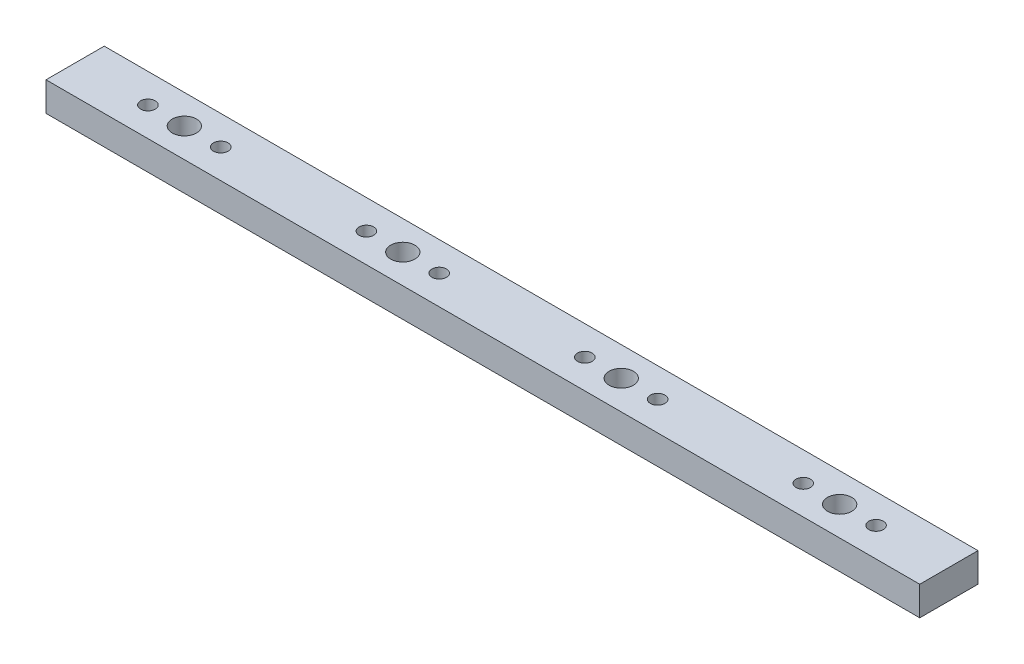
ISO-10303-21;
HEADER;
FILE_DESCRIPTION(('STEP AP214'),'2;1');
FILE_NAME('part.step','',(''),(''),'','','');
FILE_SCHEMA(('AUTOMOTIVE_DESIGN { 1 0 10303 214 1 1 1 1 }'));
ENDSEC;
DATA;
#1=APPLICATION_CONTEXT('core data for automotive mechanical design processes');
#2=APPLICATION_PROTOCOL_DEFINITION('international standard','automotive_design',2000,#1);
#3=PRODUCT_CONTEXT('',#1,'mechanical');
#4=PRODUCT('Part','Part','',(#3));
#5=PRODUCT_RELATED_PRODUCT_CATEGORY('part','',(#4));
#6=PRODUCT_DEFINITION_FORMATION('','',#4);
#7=PRODUCT_DEFINITION_CONTEXT('part definition',#1,'design');
#8=PRODUCT_DEFINITION('design','',#6,#7);
#9=PRODUCT_DEFINITION_SHAPE('','',#8);
#10=(LENGTH_UNIT() NAMED_UNIT(*) SI_UNIT(.MILLI.,.METRE.));
#11=(NAMED_UNIT(*) PLANE_ANGLE_UNIT() SI_UNIT($,.RADIAN.));
#12=(NAMED_UNIT(*) SI_UNIT($,.STERADIAN.) SOLID_ANGLE_UNIT());
#13=UNCERTAINTY_MEASURE_WITH_UNIT(LENGTH_MEASURE(1.E-05),#10,'distance_accuracy_value','');
#14=(GEOMETRIC_REPRESENTATION_CONTEXT(3) GLOBAL_UNCERTAINTY_ASSIGNED_CONTEXT((#13)) GLOBAL_UNIT_ASSIGNED_CONTEXT((#10,
#11,#12)) REPRESENTATION_CONTEXT('',''));
#15=CARTESIAN_POINT('',(0.,0.,0.));
#16=DIRECTION('',(0.,0.,1.));
#17=DIRECTION('',(1.,0.,0.));
#18=AXIS2_PLACEMENT_3D('',#15,#16,#17);
#19=CARTESIAN_POINT('',(180.,12.,12.));
#20=DIRECTION('',(-1.,0.,0.));
#21=DIRECTION('',(0.,0.,1.));
#22=AXIS2_PLACEMENT_3D('',#19,#20,#21);
#23=PLANE('',#22);
#24=DIRECTION('',(0.,0.,-1.));
#25=VECTOR('',#24,1.);
#26=CARTESIAN_POINT('',(180.,0.,12.));
#27=LINE('',#26,#25);
#28=CARTESIAN_POINT('',(180.,0.,12.));
#29=VERTEX_POINT('',#28);
#30=CARTESIAN_POINT('',(180.,0.,-12.));
#31=VERTEX_POINT('',#30);
#32=EDGE_CURVE('E104',#29,#31,#27,.T.);
#33=ORIENTED_EDGE('',*,*,#32,.T.);
#34=DIRECTION('',(0.,-1.,0.));
#35=VECTOR('',#34,1.);
#36=CARTESIAN_POINT('',(180.,12.,-12.));
#37=LINE('',#36,#35);
#38=CARTESIAN_POINT('',(180.,12.,-12.));
#39=VERTEX_POINT('',#38);
#40=EDGE_CURVE('E95',#39,#31,#37,.T.);
#41=ORIENTED_EDGE('',*,*,#40,.F.);
#42=DIRECTION('',(0.,0.,-1.));
#43=VECTOR('',#42,1.);
#44=CARTESIAN_POINT('',(180.,12.,12.));
#45=LINE('',#44,#43);
#46=CARTESIAN_POINT('',(180.,12.,12.));
#47=VERTEX_POINT('',#46);
#48=EDGE_CURVE('E89',#47,#39,#45,.T.);
#49=ORIENTED_EDGE('',*,*,#48,.F.);
#50=DIRECTION('',(0.,-1.,0.));
#51=VECTOR('',#50,1.);
#52=CARTESIAN_POINT('',(180.,12.,12.));
#53=LINE('',#52,#51);
#54=EDGE_CURVE('E100',#47,#29,#53,.T.);
#55=ORIENTED_EDGE('',*,*,#54,.T.);
#56=EDGE_LOOP('',(#33,#41,#49,#55));
#57=FACE_BOUND('',#56,.T.);
#58=ADVANCED_FACE('F35',(#57),#23,.F.);
#59=CARTESIAN_POINT('',(-180.,12.,-12.));
#60=DIRECTION('',(0.,0.,1.));
#61=DIRECTION('',(1.,0.,0.));
#62=AXIS2_PLACEMENT_3D('',#59,#60,#61);
#63=PLANE('',#62);
#64=DIRECTION('',(-1.,0.,0.));
#65=VECTOR('',#64,1.);
#66=CARTESIAN_POINT('',(-180.,0.,-12.));
#67=LINE('',#66,#65);
#68=CARTESIAN_POINT('',(-180.,0.,-12.));
#69=VERTEX_POINT('',#68);
#70=EDGE_CURVE('E94',#31,#69,#67,.T.);
#71=ORIENTED_EDGE('',*,*,#70,.T.);
#72=DIRECTION('',(0.,-1.,0.));
#73=VECTOR('',#72,1.);
#74=CARTESIAN_POINT('',(-180.,12.,-12.));
#75=LINE('',#74,#73);
#76=CARTESIAN_POINT('',(-180.,12.,-12.));
#77=VERTEX_POINT('',#76);
#78=EDGE_CURVE('E92',#77,#69,#75,.T.);
#79=ORIENTED_EDGE('',*,*,#78,.F.);
#80=DIRECTION('',(-1.,0.,0.));
#81=VECTOR('',#80,1.);
#82=CARTESIAN_POINT('',(-180.,12.,-12.));
#83=LINE('',#82,#81);
#84=EDGE_CURVE('E83',#39,#77,#83,.T.);
#85=ORIENTED_EDGE('',*,*,#84,.F.);
#86=ORIENTED_EDGE('',*,*,#40,.T.);
#87=EDGE_LOOP('',(#71,#79,#85,#86));
#88=FACE_BOUND('',#87,.T.);
#89=ADVANCED_FACE('F93',(#88),#63,.F.);
#90=CARTESIAN_POINT('',(-180.,12.,12.));
#91=DIRECTION('',(1.,0.,0.));
#92=DIRECTION('',(0.,0.,-1.));
#93=AXIS2_PLACEMENT_3D('',#90,#91,#92);
#94=PLANE('',#93);
#95=DIRECTION('',(0.,0.,1.));
#96=VECTOR('',#95,1.);
#97=CARTESIAN_POINT('',(-180.,0.,12.));
#98=LINE('',#97,#96);
#99=CARTESIAN_POINT('',(-180.,0.,12.));
#100=VERTEX_POINT('',#99);
#101=EDGE_CURVE('E69',#69,#100,#98,.T.);
#102=ORIENTED_EDGE('',*,*,#101,.T.);
#103=DIRECTION('',(0.,-1.,0.));
#104=VECTOR('',#103,1.);
#105=CARTESIAN_POINT('',(-180.,12.,12.));
#106=LINE('',#105,#104);
#107=CARTESIAN_POINT('',(-180.,12.,12.));
#108=VERTEX_POINT('',#107);
#109=EDGE_CURVE('E96',#108,#100,#106,.T.);
#110=ORIENTED_EDGE('',*,*,#109,.F.);
#111=DIRECTION('',(0.,0.,1.));
#112=VECTOR('',#111,1.);
#113=CARTESIAN_POINT('',(-180.,12.,12.));
#114=LINE('',#113,#112);
#115=EDGE_CURVE('E87',#77,#108,#114,.T.);
#116=ORIENTED_EDGE('',*,*,#115,.F.);
#117=ORIENTED_EDGE('',*,*,#78,.T.);
#118=EDGE_LOOP('',(#102,#110,#116,#117));
#119=FACE_BOUND('',#118,.T.);
#120=ADVANCED_FACE('F98',(#119),#94,.F.);
#121=CARTESIAN_POINT('',(-180.,12.,12.));
#122=DIRECTION('',(0.,0.,-1.));
#123=DIRECTION('',(-1.,0.,0.));
#124=AXIS2_PLACEMENT_3D('',#121,#122,#123);
#125=PLANE('',#124);
#126=DIRECTION('',(1.,0.,0.));
#127=VECTOR('',#126,1.);
#128=CARTESIAN_POINT('',(-180.,0.,12.));
#129=LINE('',#128,#127);
#130=EDGE_CURVE('E75',#100,#29,#129,.T.);
#131=ORIENTED_EDGE('',*,*,#130,.T.);
#132=ORIENTED_EDGE('',*,*,#54,.F.);
#133=DIRECTION('',(1.,0.,0.));
#134=VECTOR('',#133,1.);
#135=CARTESIAN_POINT('',(-180.,12.,12.));
#136=LINE('',#135,#134);
#137=EDGE_CURVE('E52',#108,#47,#136,.T.);
#138=ORIENTED_EDGE('',*,*,#137,.F.);
#139=ORIENTED_EDGE('',*,*,#109,.T.);
#140=EDGE_LOOP('',(#131,#132,#138,#139));
#141=FACE_BOUND('',#140,.T.);
#142=ADVANCED_FACE('F154',(#141),#125,.F.);
#143=CARTESIAN_POINT('',(180.,12.,-12.));
#144=DIRECTION('',(0.,-1.,0.));
#145=DIRECTION('',(0.,0.,-1.));
#146=AXIS2_PLACEMENT_3D('',#143,#144,#145);
#147=PLANE('',#146);
#148=CARTESIAN_POINT('',(-30.,12.,0.));
#149=DIRECTION('',(0.,1.,0.));
#150=DIRECTION('',(0.,0.,1.));
#151=AXIS2_PLACEMENT_3D('',#148,#149,#150);
#152=CIRCLE('',#151,3.00000000000001);
#153=CARTESIAN_POINT('',(-30.,12.,3.00000000000001));
#154=VERTEX_POINT('',#153);
#155=EDGE_CURVE('E263',#154,#154,#152,.T.);
#156=ORIENTED_EDGE('',*,*,#155,.F.);
#157=EDGE_LOOP('',(#156));
#158=FACE_BOUND('',#157,.T.);
#159=CARTESIAN_POINT('',(-60.,12.,0.));
#160=DIRECTION('',(0.,1.,0.));
#161=DIRECTION('',(0.,0.,1.));
#162=AXIS2_PLACEMENT_3D('',#159,#160,#161);
#163=CIRCLE('',#162,2.99999999999999);
#164=CARTESIAN_POINT('',(-60.,12.,2.99999999999999));
#165=VERTEX_POINT('',#164);
#166=EDGE_CURVE('E257',#165,#165,#163,.T.);
#167=ORIENTED_EDGE('',*,*,#166,.F.);
#168=EDGE_LOOP('',(#167));
#169=FACE_BOUND('',#168,.T.);
#170=CARTESIAN_POINT('',(-45.,12.,0.));
#171=DIRECTION('',(0.,1.,0.));
#172=DIRECTION('',(0.,0.,1.));
#173=AXIS2_PLACEMENT_3D('',#170,#171,#172);
#174=CIRCLE('',#173,4.99999999999999);
#175=CARTESIAN_POINT('',(-45.,12.,4.99999999999999));
#176=VERTEX_POINT('',#175);
#177=EDGE_CURVE('E249',#176,#176,#174,.T.);
#178=ORIENTED_EDGE('',*,*,#177,.F.);
#179=EDGE_LOOP('',(#178));
#180=FACE_BOUND('',#179,.T.);
#181=CARTESIAN_POINT('',(-135.,12.,0.));
#182=DIRECTION('',(0.,1.,0.));
#183=DIRECTION('',(0.,0.,1.));
#184=AXIS2_PLACEMENT_3D('',#181,#182,#183);
#185=CIRCLE('',#184,4.99999999999999);
#186=CARTESIAN_POINT('',(-135.,12.,4.99999999999999));
#187=VERTEX_POINT('',#186);
#188=EDGE_CURVE('E243',#187,#187,#185,.T.);
#189=ORIENTED_EDGE('',*,*,#188,.F.);
#190=EDGE_LOOP('',(#189));
#191=FACE_BOUND('',#190,.T.);
#192=CARTESIAN_POINT('',(-120.,12.,0.));
#193=DIRECTION('',(0.,1.,0.));
#194=DIRECTION('',(0.,0.,1.));
#195=AXIS2_PLACEMENT_3D('',#192,#193,#194);
#196=CIRCLE('',#195,3.00000000000001);
#197=CARTESIAN_POINT('',(-120.,12.,3.00000000000001));
#198=VERTEX_POINT('',#197);
#199=EDGE_CURVE('E237',#198,#198,#196,.T.);
#200=ORIENTED_EDGE('',*,*,#199,.F.);
#201=EDGE_LOOP('',(#200));
#202=FACE_BOUND('',#201,.T.);
#203=CARTESIAN_POINT('',(-150.,12.,0.));
#204=DIRECTION('',(0.,1.,0.));
#205=DIRECTION('',(0.,0.,1.));
#206=AXIS2_PLACEMENT_3D('',#203,#204,#205);
#207=CIRCLE('',#206,2.99999999999999);
#208=CARTESIAN_POINT('',(-150.,12.,2.99999999999999));
#209=VERTEX_POINT('',#208);
#210=EDGE_CURVE('E107',#209,#209,#207,.T.);
#211=ORIENTED_EDGE('',*,*,#210,.F.);
#212=EDGE_LOOP('',(#211));
#213=FACE_BOUND('',#212,.T.);
#214=ORIENTED_EDGE('',*,*,#48,.T.);
#215=ORIENTED_EDGE('',*,*,#84,.T.);
#216=ORIENTED_EDGE('',*,*,#115,.T.);
#217=ORIENTED_EDGE('',*,*,#137,.T.);
#218=EDGE_LOOP('',(#214,#215,#216,#217));
#219=FACE_BOUND('',#218,.T.);
#220=CARTESIAN_POINT('',(45.,12.,0.));
#221=DIRECTION('',(0.,1.,0.));
#222=DIRECTION('',(0.,0.,1.));
#223=AXIS2_PLACEMENT_3D('',#220,#221,#222);
#224=CIRCLE('',#223,4.99999999999999);
#225=CARTESIAN_POINT('',(45.,12.,4.99999999999999));
#226=VERTEX_POINT('',#225);
#227=EDGE_CURVE('E117',#226,#226,#224,.T.);
#228=ORIENTED_EDGE('',*,*,#227,.F.);
#229=EDGE_LOOP('',(#228));
#230=FACE_BOUND('',#229,.T.);
#231=CARTESIAN_POINT('',(135.,12.,0.));
#232=DIRECTION('',(0.,1.,0.));
#233=DIRECTION('',(0.,0.,1.));
#234=AXIS2_PLACEMENT_3D('',#231,#232,#233);
#235=CIRCLE('',#234,4.99999999999999);
#236=CARTESIAN_POINT('',(135.,12.,4.99999999999999));
#237=VERTEX_POINT('',#236);
#238=EDGE_CURVE('E123',#237,#237,#235,.T.);
#239=ORIENTED_EDGE('',*,*,#238,.F.);
#240=EDGE_LOOP('',(#239));
#241=FACE_BOUND('',#240,.T.);
#242=CARTESIAN_POINT('',(30.,12.,0.));
#243=DIRECTION('',(0.,1.,0.));
#244=DIRECTION('',(0.,0.,1.));
#245=AXIS2_PLACEMENT_3D('',#242,#243,#244);
#246=CIRCLE('',#245,2.99999999999999);
#247=CARTESIAN_POINT('',(30.,12.,2.99999999999999));
#248=VERTEX_POINT('',#247);
#249=EDGE_CURVE('E129',#248,#248,#246,.T.);
#250=ORIENTED_EDGE('',*,*,#249,.F.);
#251=EDGE_LOOP('',(#250));
#252=FACE_BOUND('',#251,.T.);
#253=CARTESIAN_POINT('',(120.,12.,0.));
#254=DIRECTION('',(0.,1.,0.));
#255=DIRECTION('',(0.,0.,1.));
#256=AXIS2_PLACEMENT_3D('',#253,#254,#255);
#257=CIRCLE('',#256,2.99999999999999);
#258=CARTESIAN_POINT('',(120.,12.,2.99999999999999));
#259=VERTEX_POINT('',#258);
#260=EDGE_CURVE('E135',#259,#259,#257,.T.);
#261=ORIENTED_EDGE('',*,*,#260,.F.);
#262=EDGE_LOOP('',(#261));
#263=FACE_BOUND('',#262,.T.);
#264=CARTESIAN_POINT('',(60.,12.,0.));
#265=DIRECTION('',(0.,1.,0.));
#266=DIRECTION('',(0.,0.,1.));
#267=AXIS2_PLACEMENT_3D('',#264,#265,#266);
#268=CIRCLE('',#267,3.00000000000001);
#269=CARTESIAN_POINT('',(60.,12.,3.00000000000001));
#270=VERTEX_POINT('',#269);
#271=EDGE_CURVE('E141',#270,#270,#268,.T.);
#272=ORIENTED_EDGE('',*,*,#271,.F.);
#273=EDGE_LOOP('',(#272));
#274=FACE_BOUND('',#273,.T.);
#275=CARTESIAN_POINT('',(150.,12.,0.));
#276=DIRECTION('',(0.,1.,0.));
#277=DIRECTION('',(0.,0.,1.));
#278=AXIS2_PLACEMENT_3D('',#275,#276,#277);
#279=CIRCLE('',#278,3.00000000000001);
#280=CARTESIAN_POINT('',(150.,12.,3.00000000000001));
#281=VERTEX_POINT('',#280);
#282=EDGE_CURVE('E11',#281,#281,#279,.T.);
#283=ORIENTED_EDGE('',*,*,#282,.F.);
#284=EDGE_LOOP('',(#283));
#285=FACE_BOUND('',#284,.T.);
#286=ADVANCED_FACE('F84',(#158,#169,#180,#191,#202,#213,#219,#230,#241,#252,#263,#274,#285),
#147,.F.);
#287=CARTESIAN_POINT('',(180.,0.,-12.));
#288=DIRECTION('',(0.,-1.,0.));
#289=DIRECTION('',(0.,0.,-1.));
#290=AXIS2_PLACEMENT_3D('',#287,#288,#289);
#291=PLANE('',#290);
#292=CARTESIAN_POINT('',(-30.,0.,0.));
#293=DIRECTION('',(0.,-1.,0.));
#294=DIRECTION('',(0.,0.,-1.));
#295=AXIS2_PLACEMENT_3D('',#292,#293,#294);
#296=CIRCLE('',#295,3.00000000000001);
#297=CARTESIAN_POINT('',(-30.,0.,-3.00000000000001));
#298=VERTEX_POINT('',#297);
#299=EDGE_CURVE('E266',#298,#298,#296,.F.);
#300=ORIENTED_EDGE('',*,*,#299,.T.);
#301=EDGE_LOOP('',(#300));
#302=FACE_BOUND('',#301,.T.);
#303=CARTESIAN_POINT('',(-60.,0.,0.));
#304=DIRECTION('',(0.,-1.,0.));
#305=DIRECTION('',(0.,0.,-1.));
#306=AXIS2_PLACEMENT_3D('',#303,#304,#305);
#307=CIRCLE('',#306,2.99999999999999);
#308=CARTESIAN_POINT('',(-60.,0.,-2.99999999999999));
#309=VERTEX_POINT('',#308);
#310=EDGE_CURVE('E260',#309,#309,#307,.F.);
#311=ORIENTED_EDGE('',*,*,#310,.T.);
#312=EDGE_LOOP('',(#311));
#313=FACE_BOUND('',#312,.T.);
#314=CARTESIAN_POINT('',(-45.,0.,0.));
#315=DIRECTION('',(0.,-1.,0.));
#316=DIRECTION('',(0.,0.,-1.));
#317=AXIS2_PLACEMENT_3D('',#314,#315,#316);
#318=CIRCLE('',#317,4.99999999999999);
#319=CARTESIAN_POINT('',(-45.,0.,-4.99999999999999));
#320=VERTEX_POINT('',#319);
#321=EDGE_CURVE('E254',#320,#320,#318,.F.);
#322=ORIENTED_EDGE('',*,*,#321,.T.);
#323=EDGE_LOOP('',(#322));
#324=FACE_BOUND('',#323,.T.);
#325=CARTESIAN_POINT('',(-135.,0.,0.));
#326=DIRECTION('',(0.,-1.,0.));
#327=DIRECTION('',(0.,0.,-1.));
#328=AXIS2_PLACEMENT_3D('',#325,#326,#327);
#329=CIRCLE('',#328,4.99999999999999);
#330=CARTESIAN_POINT('',(-135.,0.,-4.99999999999999));
#331=VERTEX_POINT('',#330);
#332=EDGE_CURVE('E246',#331,#331,#329,.F.);
#333=ORIENTED_EDGE('',*,*,#332,.T.);
#334=EDGE_LOOP('',(#333));
#335=FACE_BOUND('',#334,.T.);
#336=CARTESIAN_POINT('',(-120.,0.,0.));
#337=DIRECTION('',(0.,-1.,0.));
#338=DIRECTION('',(0.,0.,-1.));
#339=AXIS2_PLACEMENT_3D('',#336,#337,#338);
#340=CIRCLE('',#339,3.00000000000001);
#341=CARTESIAN_POINT('',(-120.,0.,-3.00000000000001));
#342=VERTEX_POINT('',#341);
#343=EDGE_CURVE('E240',#342,#342,#340,.F.);
#344=ORIENTED_EDGE('',*,*,#343,.T.);
#345=EDGE_LOOP('',(#344));
#346=FACE_BOUND('',#345,.T.);
#347=CARTESIAN_POINT('',(-150.,0.,0.));
#348=DIRECTION('',(0.,-1.,0.));
#349=DIRECTION('',(0.,0.,-1.));
#350=AXIS2_PLACEMENT_3D('',#347,#348,#349);
#351=CIRCLE('',#350,2.99999999999999);
#352=CARTESIAN_POINT('',(-150.,0.,-2.99999999999999));
#353=VERTEX_POINT('',#352);
#354=EDGE_CURVE('E232',#353,#353,#351,.F.);
#355=ORIENTED_EDGE('',*,*,#354,.T.);
#356=EDGE_LOOP('',(#355));
#357=FACE_BOUND('',#356,.T.);
#358=ORIENTED_EDGE('',*,*,#32,.F.);
#359=ORIENTED_EDGE('',*,*,#130,.F.);
#360=ORIENTED_EDGE('',*,*,#101,.F.);
#361=ORIENTED_EDGE('',*,*,#70,.F.);
#362=EDGE_LOOP('',(#358,#359,#360,#361));
#363=FACE_BOUND('',#362,.T.);
#364=CARTESIAN_POINT('',(45.,0.,0.));
#365=DIRECTION('',(0.,-1.,0.));
#366=DIRECTION('',(0.,0.,-1.));
#367=AXIS2_PLACEMENT_3D('',#364,#365,#366);
#368=CIRCLE('',#367,4.99999999999999);
#369=CARTESIAN_POINT('',(45.,0.,-4.99999999999999));
#370=VERTEX_POINT('',#369);
#371=EDGE_CURVE('E114',#370,#370,#368,.F.);
#372=ORIENTED_EDGE('',*,*,#371,.T.);
#373=EDGE_LOOP('',(#372));
#374=FACE_BOUND('',#373,.T.);
#375=CARTESIAN_POINT('',(135.,0.,0.));
#376=DIRECTION('',(0.,-1.,0.));
#377=DIRECTION('',(0.,0.,-1.));
#378=AXIS2_PLACEMENT_3D('',#375,#376,#377);
#379=CIRCLE('',#378,4.99999999999999);
#380=CARTESIAN_POINT('',(135.,0.,-4.99999999999999));
#381=VERTEX_POINT('',#380);
#382=EDGE_CURVE('E120',#381,#381,#379,.F.);
#383=ORIENTED_EDGE('',*,*,#382,.T.);
#384=EDGE_LOOP('',(#383));
#385=FACE_BOUND('',#384,.T.);
#386=CARTESIAN_POINT('',(30.,0.,0.));
#387=DIRECTION('',(0.,-1.,0.));
#388=DIRECTION('',(0.,0.,-1.));
#389=AXIS2_PLACEMENT_3D('',#386,#387,#388);
#390=CIRCLE('',#389,2.99999999999999);
#391=CARTESIAN_POINT('',(30.,0.,-2.99999999999999));
#392=VERTEX_POINT('',#391);
#393=EDGE_CURVE('E126',#392,#392,#390,.F.);
#394=ORIENTED_EDGE('',*,*,#393,.T.);
#395=EDGE_LOOP('',(#394));
#396=FACE_BOUND('',#395,.T.);
#397=CARTESIAN_POINT('',(120.,0.,0.));
#398=DIRECTION('',(0.,-1.,0.));
#399=DIRECTION('',(0.,0.,-1.));
#400=AXIS2_PLACEMENT_3D('',#397,#398,#399);
#401=CIRCLE('',#400,2.99999999999999);
#402=CARTESIAN_POINT('',(120.,0.,-2.99999999999999));
#403=VERTEX_POINT('',#402);
#404=EDGE_CURVE('E132',#403,#403,#401,.F.);
#405=ORIENTED_EDGE('',*,*,#404,.T.);
#406=EDGE_LOOP('',(#405));
#407=FACE_BOUND('',#406,.T.);
#408=CARTESIAN_POINT('',(60.,0.,0.));
#409=DIRECTION('',(0.,-1.,0.));
#410=DIRECTION('',(0.,0.,-1.));
#411=AXIS2_PLACEMENT_3D('',#408,#409,#410);
#412=CIRCLE('',#411,3.00000000000001);
#413=CARTESIAN_POINT('',(60.,0.,-3.00000000000001));
#414=VERTEX_POINT('',#413);
#415=EDGE_CURVE('E138',#414,#414,#412,.F.);
#416=ORIENTED_EDGE('',*,*,#415,.T.);
#417=EDGE_LOOP('',(#416));
#418=FACE_BOUND('',#417,.T.);
#419=CARTESIAN_POINT('',(150.,0.,0.));
#420=DIRECTION('',(0.,-1.,0.));
#421=DIRECTION('',(0.,0.,-1.));
#422=AXIS2_PLACEMENT_3D('',#419,#420,#421);
#423=CIRCLE('',#422,3.00000000000001);
#424=CARTESIAN_POINT('',(150.,0.,-3.00000000000001));
#425=VERTEX_POINT('',#424);
#426=EDGE_CURVE('E44',#425,#425,#423,.F.);
#427=ORIENTED_EDGE('',*,*,#426,.T.);
#428=EDGE_LOOP('',(#427));
#429=FACE_BOUND('',#428,.T.);
#430=ADVANCED_FACE('F146',(#302,#313,#324,#335,#346,#357,#363,#374,#385,#396,#407,#418,#429),
#291,.T.);
#431=CARTESIAN_POINT('',(-150.,-0.000999999999999265,0.));
#432=DIRECTION('',(0.,1.,0.));
#433=DIRECTION('',(0.,0.,1.));
#434=AXIS2_PLACEMENT_3D('',#431,#432,#433);
#435=CYLINDRICAL_SURFACE('',#434,2.99999999999999);
#436=ORIENTED_EDGE('',*,*,#354,.F.);
#437=EDGE_LOOP('',(#436));
#438=FACE_BOUND('',#437,.T.);
#439=ORIENTED_EDGE('',*,*,#210,.T.);
#440=EDGE_LOOP('',(#439));
#441=FACE_BOUND('',#440,.T.);
#442=ADVANCED_FACE('F161',(#438,#441),#435,.F.);
#443=CARTESIAN_POINT('',(-120.,-0.000999999999999265,0.));
#444=DIRECTION('',(0.,1.,0.));
#445=DIRECTION('',(0.,0.,1.));
#446=AXIS2_PLACEMENT_3D('',#443,#444,#445);
#447=CYLINDRICAL_SURFACE('',#446,3.00000000000001);
#448=ORIENTED_EDGE('',*,*,#343,.F.);
#449=EDGE_LOOP('',(#448));
#450=FACE_BOUND('',#449,.T.);
#451=ORIENTED_EDGE('',*,*,#199,.T.);
#452=EDGE_LOOP('',(#451));
#453=FACE_BOUND('',#452,.T.);
#454=ADVANCED_FACE('F221',(#450,#453),#447,.F.);
#455=CARTESIAN_POINT('',(-135.,-0.000999999999999265,0.));
#456=DIRECTION('',(0.,1.,0.));
#457=DIRECTION('',(0.,0.,1.));
#458=AXIS2_PLACEMENT_3D('',#455,#456,#457);
#459=CYLINDRICAL_SURFACE('',#458,4.99999999999999);
#460=ORIENTED_EDGE('',*,*,#332,.F.);
#461=EDGE_LOOP('',(#460));
#462=FACE_BOUND('',#461,.T.);
#463=ORIENTED_EDGE('',*,*,#188,.T.);
#464=EDGE_LOOP('',(#463));
#465=FACE_BOUND('',#464,.T.);
#466=ADVANCED_FACE('F217',(#462,#465),#459,.F.);
#467=CARTESIAN_POINT('',(-45.,-0.000999999999999265,0.));
#468=DIRECTION('',(0.,1.,0.));
#469=DIRECTION('',(0.,0.,1.));
#470=AXIS2_PLACEMENT_3D('',#467,#468,#469);
#471=CYLINDRICAL_SURFACE('',#470,4.99999999999999);
#472=ORIENTED_EDGE('',*,*,#321,.F.);
#473=EDGE_LOOP('',(#472));
#474=FACE_BOUND('',#473,.T.);
#475=ORIENTED_EDGE('',*,*,#177,.T.);
#476=EDGE_LOOP('',(#475));
#477=FACE_BOUND('',#476,.T.);
#478=ADVANCED_FACE('F181',(#474,#477),#471,.F.);
#479=CARTESIAN_POINT('',(45.,-0.000999999999999265,0.));
#480=DIRECTION('',(0.,1.,0.));
#481=DIRECTION('',(0.,0.,1.));
#482=AXIS2_PLACEMENT_3D('',#479,#480,#481);
#483=CYLINDRICAL_SURFACE('',#482,4.99999999999999);
#484=ORIENTED_EDGE('',*,*,#371,.F.);
#485=EDGE_LOOP('',(#484));
#486=FACE_BOUND('',#485,.T.);
#487=ORIENTED_EDGE('',*,*,#227,.T.);
#488=EDGE_LOOP('',(#487));
#489=FACE_BOUND('',#488,.T.);
#490=ADVANCED_FACE('F177',(#486,#489),#483,.F.);
#491=CARTESIAN_POINT('',(135.,-0.000999999999999265,0.));
#492=DIRECTION('',(0.,1.,0.));
#493=DIRECTION('',(0.,0.,1.));
#494=AXIS2_PLACEMENT_3D('',#491,#492,#493);
#495=CYLINDRICAL_SURFACE('',#494,4.99999999999999);
#496=ORIENTED_EDGE('',*,*,#382,.F.);
#497=EDGE_LOOP('',(#496));
#498=FACE_BOUND('',#497,.T.);
#499=ORIENTED_EDGE('',*,*,#238,.T.);
#500=EDGE_LOOP('',(#499));
#501=FACE_BOUND('',#500,.T.);
#502=ADVANCED_FACE('F180',(#498,#501),#495,.F.);
#503=CARTESIAN_POINT('',(-60.,-0.000999999999999265,0.));
#504=DIRECTION('',(0.,1.,0.));
#505=DIRECTION('',(0.,0.,1.));
#506=AXIS2_PLACEMENT_3D('',#503,#504,#505);
#507=CYLINDRICAL_SURFACE('',#506,2.99999999999999);
#508=ORIENTED_EDGE('',*,*,#310,.F.);
#509=EDGE_LOOP('',(#508));
#510=FACE_BOUND('',#509,.T.);
#511=ORIENTED_EDGE('',*,*,#166,.T.);
#512=EDGE_LOOP('',(#511));
#513=FACE_BOUND('',#512,.T.);
#514=ADVANCED_FACE('F185',(#510,#513),#507,.F.);
#515=CARTESIAN_POINT('',(30.,-0.000999999999999265,0.));
#516=DIRECTION('',(0.,1.,0.));
#517=DIRECTION('',(0.,0.,1.));
#518=AXIS2_PLACEMENT_3D('',#515,#516,#517);
#519=CYLINDRICAL_SURFACE('',#518,2.99999999999999);
#520=ORIENTED_EDGE('',*,*,#393,.F.);
#521=EDGE_LOOP('',(#520));
#522=FACE_BOUND('',#521,.T.);
#523=ORIENTED_EDGE('',*,*,#249,.T.);
#524=EDGE_LOOP('',(#523));
#525=FACE_BOUND('',#524,.T.);
#526=ADVANCED_FACE('F187',(#522,#525),#519,.F.);
#527=CARTESIAN_POINT('',(120.,-0.000999999999999265,0.));
#528=DIRECTION('',(0.,1.,0.));
#529=DIRECTION('',(0.,0.,1.));
#530=AXIS2_PLACEMENT_3D('',#527,#528,#529);
#531=CYLINDRICAL_SURFACE('',#530,2.99999999999999);
#532=ORIENTED_EDGE('',*,*,#404,.F.);
#533=EDGE_LOOP('',(#532));
#534=FACE_BOUND('',#533,.T.);
#535=ORIENTED_EDGE('',*,*,#260,.T.);
#536=EDGE_LOOP('',(#535));
#537=FACE_BOUND('',#536,.T.);
#538=ADVANCED_FACE('F190',(#534,#537),#531,.F.);
#539=CARTESIAN_POINT('',(-30.,-0.000999999999999265,0.));
#540=DIRECTION('',(0.,1.,0.));
#541=DIRECTION('',(0.,0.,1.));
#542=AXIS2_PLACEMENT_3D('',#539,#540,#541);
#543=CYLINDRICAL_SURFACE('',#542,3.00000000000001);
#544=ORIENTED_EDGE('',*,*,#299,.F.);
#545=EDGE_LOOP('',(#544));
#546=FACE_BOUND('',#545,.T.);
#547=ORIENTED_EDGE('',*,*,#155,.T.);
#548=EDGE_LOOP('',(#547));
#549=FACE_BOUND('',#548,.T.);
#550=ADVANCED_FACE('F193',(#546,#549),#543,.F.);
#551=CARTESIAN_POINT('',(60.,-0.000999999999999265,0.));
#552=DIRECTION('',(0.,1.,0.));
#553=DIRECTION('',(0.,0.,1.));
#554=AXIS2_PLACEMENT_3D('',#551,#552,#553);
#555=CYLINDRICAL_SURFACE('',#554,3.00000000000001);
#556=ORIENTED_EDGE('',*,*,#415,.F.);
#557=EDGE_LOOP('',(#556));
#558=FACE_BOUND('',#557,.T.);
#559=ORIENTED_EDGE('',*,*,#271,.T.);
#560=EDGE_LOOP('',(#559));
#561=FACE_BOUND('',#560,.T.);
#562=ADVANCED_FACE('F150',(#558,#561),#555,.F.);
#563=CARTESIAN_POINT('',(150.,-0.000999999999999265,0.));
#564=DIRECTION('',(0.,1.,0.));
#565=DIRECTION('',(0.,0.,1.));
#566=AXIS2_PLACEMENT_3D('',#563,#564,#565);
#567=CYLINDRICAL_SURFACE('',#566,3.00000000000001);
#568=ORIENTED_EDGE('',*,*,#426,.F.);
#569=EDGE_LOOP('',(#568));
#570=FACE_BOUND('',#569,.T.);
#571=ORIENTED_EDGE('',*,*,#282,.T.);
#572=EDGE_LOOP('',(#571));
#573=FACE_BOUND('',#572,.T.);
#574=ADVANCED_FACE('F37',(#570,#573),#567,.F.);
#575=CLOSED_SHELL('',(#58,#89,#120,#142,#286,#430,#442,#454,#466,#478,#490,#502,#514,#526,#538,
#550,#562,#574));
#576=MANIFOLD_SOLID_BREP('B2',#575);
#577=ADVANCED_BREP_SHAPE_REPRESENTATION('',(#18,#576),#14);
#578=SHAPE_DEFINITION_REPRESENTATION(#9,#577);
ENDSEC;
END-ISO-10303-21;
